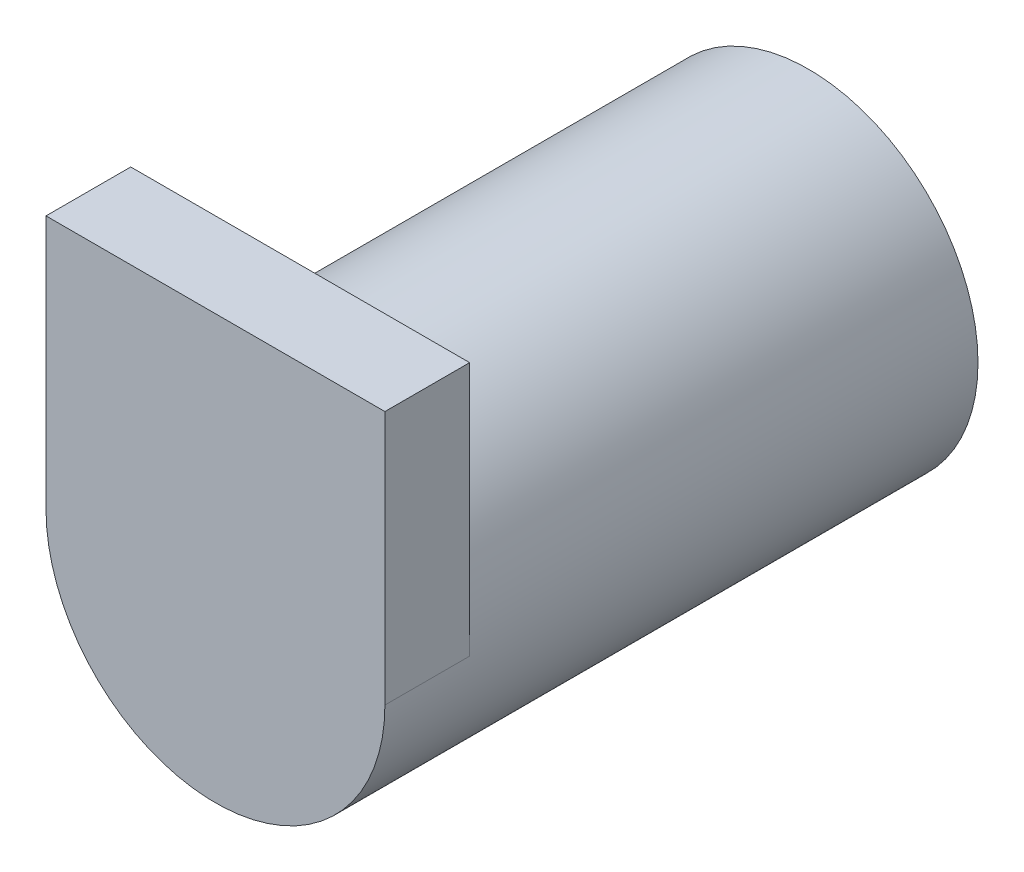
ISO-10303-21;
HEADER;
FILE_DESCRIPTION(('STEP AP214'),'2;1');
FILE_NAME('part.step','',(''),(''),'','','');
FILE_SCHEMA(('AUTOMOTIVE_DESIGN { 1 0 10303 214 1 1 1 1 }'));
ENDSEC;
DATA;
#1=APPLICATION_CONTEXT('core data for automotive mechanical design processes');
#2=APPLICATION_PROTOCOL_DEFINITION('international standard','automotive_design',2000,#1);
#3=PRODUCT_CONTEXT('',#1,'mechanical');
#4=PRODUCT('Part','Part','',(#3));
#5=PRODUCT_RELATED_PRODUCT_CATEGORY('part','',(#4));
#6=PRODUCT_DEFINITION_FORMATION('','',#4);
#7=PRODUCT_DEFINITION_CONTEXT('part definition',#1,'design');
#8=PRODUCT_DEFINITION('design','',#6,#7);
#9=PRODUCT_DEFINITION_SHAPE('','',#8);
#10=(LENGTH_UNIT() NAMED_UNIT(*) SI_UNIT(.MILLI.,.METRE.));
#11=(NAMED_UNIT(*) PLANE_ANGLE_UNIT() SI_UNIT($,.RADIAN.));
#12=(NAMED_UNIT(*) SI_UNIT($,.STERADIAN.) SOLID_ANGLE_UNIT());
#13=UNCERTAINTY_MEASURE_WITH_UNIT(LENGTH_MEASURE(1.E-05),#10,'distance_accuracy_value','');
#14=(GEOMETRIC_REPRESENTATION_CONTEXT(3) GLOBAL_UNCERTAINTY_ASSIGNED_CONTEXT((#13)) GLOBAL_UNIT_ASSIGNED_CONTEXT((#10,
#11,#12)) REPRESENTATION_CONTEXT('',''));
#15=CARTESIAN_POINT('',(0.,0.,0.));
#16=DIRECTION('',(0.,0.,1.));
#17=DIRECTION('',(1.,0.,0.));
#18=AXIS2_PLACEMENT_3D('',#15,#16,#17);
#19=CARTESIAN_POINT('',(0.,0.,0.));
#20=DIRECTION('',(0.,0.,1.));
#21=DIRECTION('',(1.,0.,0.));
#22=AXIS2_PLACEMENT_3D('',#19,#20,#21);
#23=PLANE('',#22);
#24=CARTESIAN_POINT('',(0.,0.,0.));
#25=DIRECTION('',(0.,0.,1.));
#26=DIRECTION('',(1.,0.,0.));
#27=AXIS2_PLACEMENT_3D('',#24,#25,#26);
#28=CIRCLE('',#27,25.4);
#29=CARTESIAN_POINT('',(25.4,0.,0.));
#30=VERTEX_POINT('',#29);
#31=EDGE_CURVE('E109',#30,#30,#28,.T.);
#32=ORIENTED_EDGE('',*,*,#31,.F.);
#33=EDGE_LOOP('',(#32));
#34=FACE_BOUND('',#33,.T.);
#35=CARTESIAN_POINT('',(0.,0.,0.));
#36=DIRECTION('',(0.,0.,1.));
#37=DIRECTION('',(1.,0.,0.));
#38=AXIS2_PLACEMENT_3D('',#35,#36,#37);
#39=CIRCLE('',#38,3.175);
#40=CARTESIAN_POINT('',(3.175,0.,0.));
#41=VERTEX_POINT('',#40);
#42=EDGE_CURVE('E11',#41,#41,#39,.F.);
#43=ORIENTED_EDGE('',*,*,#42,.F.);
#44=EDGE_LOOP('',(#43));
#45=FACE_BOUND('',#44,.T.);
#46=ADVANCED_FACE('F36',(#34,#45),#23,.F.);
#47=CARTESIAN_POINT('',(0.,0.,76.2));
#48=DIRECTION('',(0.,0.,-1.));
#49=DIRECTION('',(-1.,0.,0.));
#50=AXIS2_PLACEMENT_3D('',#47,#48,#49);
#51=CYLINDRICAL_SURFACE('',#50,25.4);
#52=CARTESIAN_POINT('',(0.,0.,76.2));
#53=DIRECTION('',(0.,0.,1.));
#54=DIRECTION('',(1.,0.,0.));
#55=AXIS2_PLACEMENT_3D('',#52,#53,#54);
#56=CIRCLE('',#55,25.4);
#57=CARTESIAN_POINT('',(25.4,0.,76.2));
#58=VERTEX_POINT('',#57);
#59=CARTESIAN_POINT('',(-25.4,0.,76.2));
#60=VERTEX_POINT('',#59);
#61=EDGE_CURVE('E44',#58,#60,#56,.T.);
#62=ORIENTED_EDGE('',*,*,#61,.F.);
#63=DIRECTION('',(0.,0.,-1.));
#64=VECTOR('',#63,1.);
#65=CARTESIAN_POINT('',(25.4,0.,88.9));
#66=LINE('',#65,#64);
#67=CARTESIAN_POINT('',(25.4,0.,88.9));
#68=VERTEX_POINT('',#67);
#69=EDGE_CURVE('E97',#68,#58,#66,.T.);
#70=ORIENTED_EDGE('',*,*,#69,.F.);
#71=CARTESIAN_POINT('',(0.,0.,88.9));
#72=DIRECTION('',(0.,0.,1.));
#73=DIRECTION('',(1.,0.,0.));
#74=AXIS2_PLACEMENT_3D('',#71,#72,#73);
#75=CIRCLE('',#74,25.4);
#76=CARTESIAN_POINT('',(-25.4,0.,88.9));
#77=VERTEX_POINT('',#76);
#78=EDGE_CURVE('E88',#77,#68,#75,.T.);
#79=ORIENTED_EDGE('',*,*,#78,.F.);
#80=DIRECTION('',(0.,0.,-1.));
#81=VECTOR('',#80,1.);
#82=CARTESIAN_POINT('',(-25.4,0.,88.9));
#83=LINE('',#82,#81);
#84=EDGE_CURVE('E58',#77,#60,#83,.T.);
#85=ORIENTED_EDGE('',*,*,#84,.T.);
#86=EDGE_LOOP('',(#62,#70,#79,#85));
#87=FACE_BOUND('',#86,.T.);
#88=ORIENTED_EDGE('',*,*,#31,.T.);
#89=EDGE_LOOP('',(#88));
#90=FACE_BOUND('',#89,.T.);
#91=ADVANCED_FACE('F38',(#87,#90),#51,.T.);
#92=CARTESIAN_POINT('',(0.,-57.0432865461271,76.2));
#93=DIRECTION('',(0.,0.,1.));
#94=DIRECTION('',(1.,0.,0.));
#95=AXIS2_PLACEMENT_3D('',#92,#93,#94);
#96=PLANE('',#95);
#97=DIRECTION('',(0.,1.,0.));
#98=VECTOR('',#97,1.);
#99=CARTESIAN_POINT('',(25.4,-57.0432865461271,76.2));
#100=LINE('',#99,#98);
#101=CARTESIAN_POINT('',(25.4,38.1,76.2));
#102=VERTEX_POINT('',#101);
#103=EDGE_CURVE('E94',#58,#102,#100,.T.);
#104=ORIENTED_EDGE('',*,*,#103,.F.);
#105=ORIENTED_EDGE('',*,*,#61,.T.);
#106=DIRECTION('',(0.,1.,0.));
#107=VECTOR('',#106,1.);
#108=CARTESIAN_POINT('',(-25.4,-57.0432865461271,76.2));
#109=LINE('',#108,#107);
#110=CARTESIAN_POINT('',(-25.4,38.1,76.2));
#111=VERTEX_POINT('',#110);
#112=EDGE_CURVE('E107',#60,#111,#109,.T.);
#113=ORIENTED_EDGE('',*,*,#112,.T.);
#114=DIRECTION('',(1.,0.,0.));
#115=VECTOR('',#114,1.);
#116=CARTESIAN_POINT('',(0.,38.1,76.2));
#117=LINE('',#116,#115);
#118=EDGE_CURVE('E105',#111,#102,#117,.T.);
#119=ORIENTED_EDGE('',*,*,#118,.T.);
#120=EDGE_LOOP('',(#104,#105,#113,#119));
#121=FACE_BOUND('',#120,.T.);
#122=ADVANCED_FACE('F143',(#121),#96,.F.);
#123=CARTESIAN_POINT('',(25.4,-57.0432865461271,88.9));
#124=DIRECTION('',(-1.,0.,0.));
#125=DIRECTION('',(0.,0.,1.));
#126=AXIS2_PLACEMENT_3D('',#123,#124,#125);
#127=PLANE('',#126);
#128=ORIENTED_EDGE('',*,*,#103,.T.);
#129=DIRECTION('',(0.,0.,-1.));
#130=VECTOR('',#129,1.);
#131=CARTESIAN_POINT('',(25.4,38.1,88.9));
#132=LINE('',#131,#130);
#133=CARTESIAN_POINT('',(25.4,38.1,88.9));
#134=VERTEX_POINT('',#133);
#135=EDGE_CURVE('E92',#134,#102,#132,.T.);
#136=ORIENTED_EDGE('',*,*,#135,.F.);
#137=DIRECTION('',(0.,1.,0.));
#138=VECTOR('',#137,1.);
#139=CARTESIAN_POINT('',(25.4,-57.0432865461271,88.9));
#140=LINE('',#139,#138);
#141=EDGE_CURVE('E80',#68,#134,#140,.T.);
#142=ORIENTED_EDGE('',*,*,#141,.F.);
#143=ORIENTED_EDGE('',*,*,#69,.T.);
#144=EDGE_LOOP('',(#128,#136,#142,#143));
#145=FACE_BOUND('',#144,.T.);
#146=ADVANCED_FACE('F93',(#145),#127,.F.);
#147=CARTESIAN_POINT('',(0.,38.1,88.9));
#148=DIRECTION('',(0.,1.,0.));
#149=DIRECTION('',(0.,0.,1.));
#150=AXIS2_PLACEMENT_3D('',#147,#148,#149);
#151=PLANE('',#150);
#152=ORIENTED_EDGE('',*,*,#118,.F.);
#153=DIRECTION('',(0.,0.,-1.));
#154=VECTOR('',#153,1.);
#155=CARTESIAN_POINT('',(-25.4,38.1,88.9));
#156=LINE('',#155,#154);
#157=CARTESIAN_POINT('',(-25.4,38.1,88.9));
#158=VERTEX_POINT('',#157);
#159=EDGE_CURVE('E72',#158,#111,#156,.T.);
#160=ORIENTED_EDGE('',*,*,#159,.F.);
#161=DIRECTION('',(1.,0.,0.));
#162=VECTOR('',#161,1.);
#163=CARTESIAN_POINT('',(0.,38.1,88.9));
#164=LINE('',#163,#162);
#165=EDGE_CURVE('E87',#158,#134,#164,.T.);
#166=ORIENTED_EDGE('',*,*,#165,.T.);
#167=ORIENTED_EDGE('',*,*,#135,.T.);
#168=EDGE_LOOP('',(#152,#160,#166,#167));
#169=FACE_BOUND('',#168,.T.);
#170=ADVANCED_FACE('F99',(#169),#151,.T.);
#171=CARTESIAN_POINT('',(-25.4,-57.0432865461271,88.9));
#172=DIRECTION('',(-1.,0.,0.));
#173=DIRECTION('',(0.,0.,1.));
#174=AXIS2_PLACEMENT_3D('',#171,#172,#173);
#175=PLANE('',#174);
#176=ORIENTED_EDGE('',*,*,#112,.F.);
#177=ORIENTED_EDGE('',*,*,#84,.F.);
#178=DIRECTION('',(0.,1.,0.));
#179=VECTOR('',#178,1.);
#180=CARTESIAN_POINT('',(-25.4,-57.0432865461271,88.9));
#181=LINE('',#180,#179);
#182=EDGE_CURVE('E100',#77,#158,#181,.T.);
#183=ORIENTED_EDGE('',*,*,#182,.T.);
#184=ORIENTED_EDGE('',*,*,#159,.T.);
#185=EDGE_LOOP('',(#176,#177,#183,#184));
#186=FACE_BOUND('',#185,.T.);
#187=ADVANCED_FACE('F151',(#186),#175,.T.);
#188=CARTESIAN_POINT('',(0.,-57.0432865461271,88.9));
#189=DIRECTION('',(0.,0.,1.));
#190=DIRECTION('',(1.,0.,0.));
#191=AXIS2_PLACEMENT_3D('',#188,#189,#190);
#192=PLANE('',#191);
#193=ORIENTED_EDGE('',*,*,#78,.T.);
#194=ORIENTED_EDGE('',*,*,#141,.T.);
#195=ORIENTED_EDGE('',*,*,#165,.F.);
#196=ORIENTED_EDGE('',*,*,#182,.F.);
#197=EDGE_LOOP('',(#193,#194,#195,#196));
#198=FACE_BOUND('',#197,.T.);
#199=ADVANCED_FACE('F84',(#198),#192,.T.);
#200=CARTESIAN_POINT('',(0.,0.,-12.7));
#201=DIRECTION('',(0.,0.,1.));
#202=DIRECTION('',(1.,0.,0.));
#203=AXIS2_PLACEMENT_3D('',#200,#201,#202);
#204=CYLINDRICAL_SURFACE('',#203,3.175);
#205=CARTESIAN_POINT('',(0.,0.,-12.7));
#206=DIRECTION('',(0.,0.,-1.));
#207=DIRECTION('',(-1.,0.,0.));
#208=AXIS2_PLACEMENT_3D('',#205,#206,#207);
#209=CIRCLE('',#208,3.175);
#210=CARTESIAN_POINT('',(-3.175,0.,-12.7));
#211=VERTEX_POINT('',#210);
#212=EDGE_CURVE('E116',#211,#211,#209,.T.);
#213=ORIENTED_EDGE('',*,*,#212,.F.);
#214=EDGE_LOOP('',(#213));
#215=FACE_BOUND('',#214,.T.);
#216=ORIENTED_EDGE('',*,*,#42,.T.);
#217=EDGE_LOOP('',(#216));
#218=FACE_BOUND('',#217,.T.);
#219=ADVANCED_FACE('F132',(#215,#218),#204,.T.);
#220=CARTESIAN_POINT('',(0.,0.,-12.7));
#221=DIRECTION('',(0.,0.,-1.));
#222=DIRECTION('',(-1.,0.,0.));
#223=AXIS2_PLACEMENT_3D('',#220,#221,#222);
#224=PLANE('',#223);
#225=ORIENTED_EDGE('',*,*,#212,.T.);
#226=EDGE_LOOP('',(#225));
#227=FACE_BOUND('',#226,.T.);
#228=ADVANCED_FACE('F130',(#227),#224,.T.);
#229=CLOSED_SHELL('',(#46,#91,#122,#146,#170,#187,#199,#219,#228));
#230=MANIFOLD_SOLID_BREP('B2',#229);
#231=ADVANCED_BREP_SHAPE_REPRESENTATION('',(#18,#230),#14);
#232=SHAPE_DEFINITION_REPRESENTATION(#9,#231);
ENDSEC;
END-ISO-10303-21;
